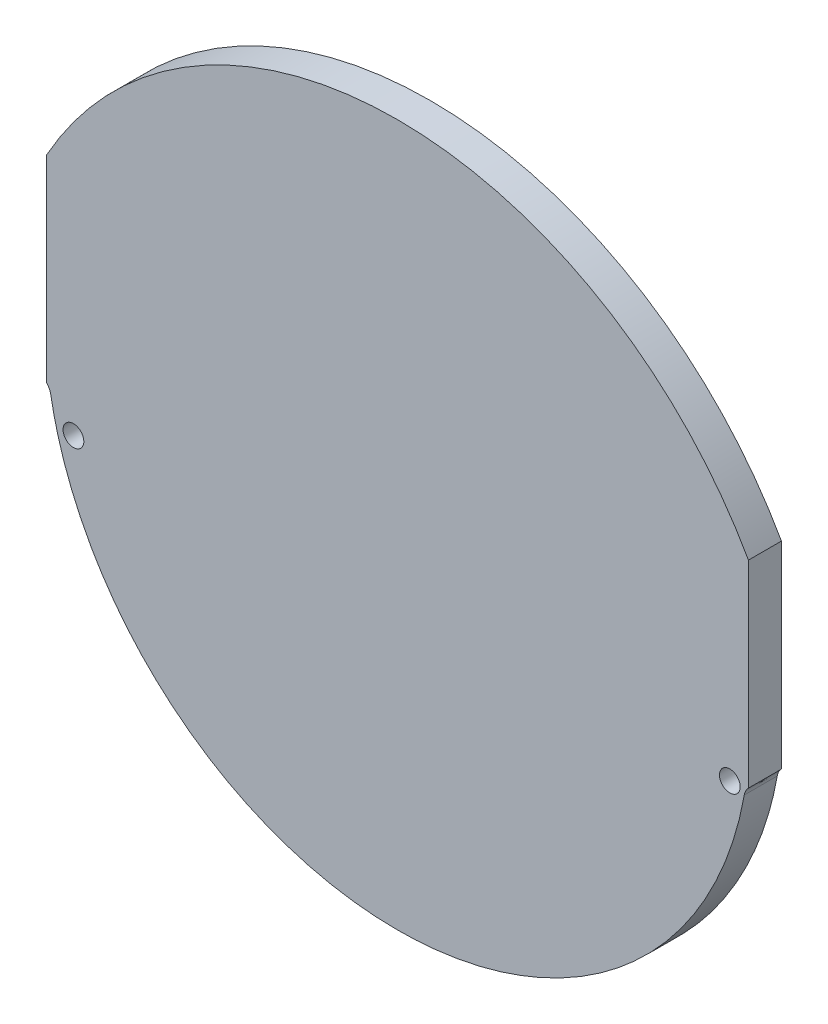
ISO-10303-21;
HEADER;
FILE_DESCRIPTION(('STEP AP214'),'2;1');
FILE_NAME('part.step','',(''),(''),'','','');
FILE_SCHEMA(('AUTOMOTIVE_DESIGN { 1 0 10303 214 1 1 1 1 }'));
ENDSEC;
DATA;
#1=APPLICATION_CONTEXT('core data for automotive mechanical design processes');
#2=APPLICATION_PROTOCOL_DEFINITION('international standard','automotive_design',2000,#1);
#3=PRODUCT_CONTEXT('',#1,'mechanical');
#4=PRODUCT('Part','Part','',(#3));
#5=PRODUCT_RELATED_PRODUCT_CATEGORY('part','',(#4));
#6=PRODUCT_DEFINITION_FORMATION('','',#4);
#7=PRODUCT_DEFINITION_CONTEXT('part definition',#1,'design');
#8=PRODUCT_DEFINITION('design','',#6,#7);
#9=PRODUCT_DEFINITION_SHAPE('','',#8);
#10=(LENGTH_UNIT() NAMED_UNIT(*) SI_UNIT(.MILLI.,.METRE.));
#11=(NAMED_UNIT(*) PLANE_ANGLE_UNIT() SI_UNIT($,.RADIAN.));
#12=(NAMED_UNIT(*) SI_UNIT($,.STERADIAN.) SOLID_ANGLE_UNIT());
#13=UNCERTAINTY_MEASURE_WITH_UNIT(LENGTH_MEASURE(1.E-05),#10,'distance_accuracy_value','');
#14=(GEOMETRIC_REPRESENTATION_CONTEXT(3) GLOBAL_UNCERTAINTY_ASSIGNED_CONTEXT((#13)) GLOBAL_UNIT_ASSIGNED_CONTEXT((#10,
#11,#12)) REPRESENTATION_CONTEXT('',''));
#15=CARTESIAN_POINT('',(0.,0.,0.));
#16=DIRECTION('',(0.,0.,1.));
#17=DIRECTION('',(1.,0.,0.));
#18=AXIS2_PLACEMENT_3D('',#15,#16,#17);
#19=CARTESIAN_POINT('',(-33.3995339320001,-5.83897062436158,266.377513628299));
#20=CARTESIAN_POINT('',(-33.0522532852939,-7.79830969295023,266.377513628299));
#21=CARTESIAN_POINT('',(-32.2812242202669,-10.6474672692101,266.377513628299));
#22=CARTESIAN_POINT('',(-31.1457311342893,-13.3656915925748,266.377513628299));
#23=CARTESIAN_POINT('',(-30.5181652192013,-14.7033137181358,266.377513628299));
#24=CARTESIAN_POINT('',(-30.2990203098189,-15.1456109818265,266.377513628299));
#25=CARTESIAN_POINT('',(-29.8408870436323,-16.0230767750388,266.377513628299));
#26=CARTESIAN_POINT('',(-29.6012280362201,-16.4592508586859,266.377513628299));
#27=CARTESIAN_POINT('',(-28.3592084487197,-18.6073694921688,266.377513628299));
#28=CARTESIAN_POINT('',(-27.2298143300265,-20.2158265888063,266.377513628299));
#29=CARTESIAN_POINT('',(-25.0188567184647,-22.8405680941703,266.377513628299));
#30=CARTESIAN_POINT('',(-23.9959305667219,-23.9043734804345,266.377513628299));
#31=CARTESIAN_POINT('',(-22.5326828725777,-25.2422683729324,266.377513628299));
#32=CARTESIAN_POINT('',(-22.1581080645461,-25.5704468359756,266.377513628299));
#33=CARTESIAN_POINT('',(-20.260791978996,-27.1617011530434,266.377513628299));
#34=CARTESIAN_POINT('',(-18.652171115365,-28.2877371001331,266.377513628299));
#35=CARTESIAN_POINT('',(-16.1029838612524,-29.756171423986,266.377513628299));
#36=CARTESIAN_POINT('',(-15.2305493530818,-30.2088859186686,266.377513628299));
#37=CARTESIAN_POINT('',(-13.4402988902694,-31.0408352854184,266.377513628299));
#38=CARTESIAN_POINT('',(-12.5182440430673,-31.4216027233659,266.377513628299));
#39=CARTESIAN_POINT('',(-9.73033512710061,-32.4368506431208,266.377513628299));
#40=CARTESIAN_POINT('',(-7.83504811353646,-32.9470482291163,266.377513628299));
#41=CARTESIAN_POINT('',(-4.93618049145972,-33.4582341560251,266.377513628299));
#42=CARTESIAN_POINT('',(-3.96056971174686,-33.5862835283673,266.377513628299));
#43=CARTESIAN_POINT('',(-1.9905687605789,-33.7570714582641,266.377513628299));
#44=CARTESIAN_POINT('',(-0.994552943017528,-33.7995927213897,266.377513628299));
#45=CARTESIAN_POINT('',(7.01465112202871E-06,-33.7996091059439,266.377513628299));
#46=B_SPLINE_CURVE_WITH_KNOTS('',3,(#19,#20,#21,#22,#23,#24,#25,#26,#27,#28,#29,#30,#31,#32,#33,
#34,#35,#36,#37,#38,#39,#40,#41,#42,#43,#44,#45),.UNSPECIFIED.,.F.,.F.,(4,1,2,2,2,2,2,2,2,2,2,2,
2,4),(0.,0.124999999999999,0.187499999999999,0.218749999999999,0.249999999999999,
0.374999999999998,0.468749999999998,0.499999999999998,0.624999999999999,0.687499999999999,
0.749999999999999,0.875,0.9375,1.),.UNSPECIFIED.);
#47=DIRECTION('',(0.,0.,-1.));
#48=VECTOR('',#47,1.);
#49=SURFACE_OF_LINEAR_EXTRUSION('',#46,#48);
#50=CARTESIAN_POINT('',(-33.3995339320001,-5.83897062436158,263.202513628299));
#51=CARTESIAN_POINT('',(-33.0522532852939,-7.79830969295023,263.202513628299));
#52=CARTESIAN_POINT('',(-32.2812242202669,-10.6474672692101,263.202513628299));
#53=CARTESIAN_POINT('',(-31.1457311342893,-13.3656915925748,263.202513628299));
#54=CARTESIAN_POINT('',(-30.5181652192013,-14.7033137181358,263.202513628299));
#55=CARTESIAN_POINT('',(-30.2990203098189,-15.1456109818265,263.202513628299));
#56=CARTESIAN_POINT('',(-29.8408870436323,-16.0230767750388,263.202513628299));
#57=CARTESIAN_POINT('',(-29.6012280362201,-16.4592508586859,263.202513628299));
#58=CARTESIAN_POINT('',(-28.3592084487197,-18.6073694921688,263.202513628299));
#59=CARTESIAN_POINT('',(-27.2298143300265,-20.2158265888063,263.202513628299));
#60=CARTESIAN_POINT('',(-25.0188567184647,-22.8405680941703,263.202513628299));
#61=CARTESIAN_POINT('',(-23.9959305667219,-23.9043734804345,263.202513628299));
#62=CARTESIAN_POINT('',(-22.5326828725777,-25.2422683729324,263.202513628299));
#63=CARTESIAN_POINT('',(-22.1581080645461,-25.5704468359756,263.202513628299));
#64=CARTESIAN_POINT('',(-20.260791978996,-27.1617011530434,263.202513628299));
#65=CARTESIAN_POINT('',(-18.652171115365,-28.2877371001331,263.202513628299));
#66=CARTESIAN_POINT('',(-16.1029838612524,-29.756171423986,263.202513628299));
#67=CARTESIAN_POINT('',(-15.2305493530818,-30.2088859186686,263.202513628299));
#68=CARTESIAN_POINT('',(-13.4402988902694,-31.0408352854184,263.202513628299));
#69=CARTESIAN_POINT('',(-12.5182440430673,-31.4216027233659,263.202513628299));
#70=CARTESIAN_POINT('',(-9.73033512710061,-32.4368506431208,263.202513628299));
#71=CARTESIAN_POINT('',(-7.83504811353646,-32.9470482291163,263.202513628299));
#72=CARTESIAN_POINT('',(-4.93618049145972,-33.4582341560251,263.202513628299));
#73=CARTESIAN_POINT('',(-3.96056971174686,-33.5862835283673,263.202513628299));
#74=CARTESIAN_POINT('',(-1.9905687605789,-33.7570714582641,263.202513628299));
#75=CARTESIAN_POINT('',(-0.994552943017528,-33.7995927213897,263.202513628299));
#76=CARTESIAN_POINT('',(7.01465112202871E-06,-33.7996091059439,263.202513628299));
#77=B_SPLINE_CURVE_WITH_KNOTS('',3,(#50,#51,#52,#53,#54,#55,#56,#57,#58,#59,#60,#61,#62,#63,#64,
#65,#66,#67,#68,#69,#70,#71,#72,#73,#74,#75,#76),.UNSPECIFIED.,.F.,.F.,(4,1,2,2,2,2,2,2,2,2,2,2,
2,4),(0.,0.124999999999999,0.187499999999999,0.218749999999999,0.249999999999999,
0.374999999999998,0.468749999999998,0.499999999999998,0.624999999999999,0.687499999999999,
0.749999999999999,0.875,0.9375,1.),.UNSPECIFIED.);
#78=CARTESIAN_POINT('',(-33.3995339320001,-5.83897062436158,263.202513628299));
#79=VERTEX_POINT('',#78);
#80=CARTESIAN_POINT('',(7.01378040821113E-06,-33.7996091059439,263.202513628299));
#81=VERTEX_POINT('',#80);
#82=EDGE_CURVE('E260',#79,#81,#77,.T.);
#83=ORIENTED_EDGE('',*,*,#82,.T.);
#84=DIRECTION('',(0.,0.,-1.));
#85=VECTOR('',#84,1.);
#86=CARTESIAN_POINT('',(7.01378040821113E-06,-33.7996091059439,266.377513628299));
#87=LINE('',#86,#85);
#88=CARTESIAN_POINT('',(7.01378040821113E-06,-33.7996091059439,266.377513628299));
#89=VERTEX_POINT('',#88);
#90=EDGE_CURVE('E11',#89,#81,#87,.T.);
#91=ORIENTED_EDGE('',*,*,#90,.F.);
#92=CARTESIAN_POINT('',(7.01465112202871E-06,-33.7996091059439,266.377513628299));
#93=CARTESIAN_POINT('',(-0.994552943017528,-33.7995927213897,266.377513628299));
#94=CARTESIAN_POINT('',(-1.9905687605789,-33.7570714582641,266.377513628299));
#95=CARTESIAN_POINT('',(-3.96056971174686,-33.5862835283673,266.377513628299));
#96=CARTESIAN_POINT('',(-4.93618049145972,-33.4582341560251,266.377513628299));
#97=CARTESIAN_POINT('',(-7.83504811353646,-32.9470482291163,266.377513628299));
#98=CARTESIAN_POINT('',(-9.73033512710061,-32.4368506431208,266.377513628299));
#99=CARTESIAN_POINT('',(-12.5182440430673,-31.4216027233659,266.377513628299));
#100=CARTESIAN_POINT('',(-13.4402988902694,-31.0408352854184,266.377513628299));
#101=CARTESIAN_POINT('',(-15.2305493530818,-30.2088859186686,266.377513628299));
#102=CARTESIAN_POINT('',(-16.1029838612524,-29.756171423986,266.377513628299));
#103=CARTESIAN_POINT('',(-18.652171115365,-28.2877371001331,266.377513628299));
#104=CARTESIAN_POINT('',(-20.260791978996,-27.1617011530434,266.377513628299));
#105=CARTESIAN_POINT('',(-22.1581080645461,-25.5704468359756,266.377513628299));
#106=CARTESIAN_POINT('',(-22.5326828725777,-25.2422683729324,266.377513628299));
#107=CARTESIAN_POINT('',(-23.9959305667219,-23.9043734804345,266.377513628299));
#108=CARTESIAN_POINT('',(-25.0188567184647,-22.8405680941703,266.377513628299));
#109=CARTESIAN_POINT('',(-27.2298143300265,-20.2158265888063,266.377513628299));
#110=CARTESIAN_POINT('',(-28.3592084487197,-18.6073694921688,266.377513628299));
#111=CARTESIAN_POINT('',(-29.6012280362201,-16.4592508586859,266.377513628299));
#112=CARTESIAN_POINT('',(-29.8408870436323,-16.0230767750388,266.377513628299));
#113=CARTESIAN_POINT('',(-30.2990203098189,-15.1456109818265,266.377513628299));
#114=CARTESIAN_POINT('',(-30.5181652192013,-14.7033137181358,266.377513628299));
#115=CARTESIAN_POINT('',(-31.1457311342893,-13.3656915925748,266.377513628299));
#116=CARTESIAN_POINT('',(-32.2812242202669,-10.6474672692101,266.377513628299));
#117=CARTESIAN_POINT('',(-33.0522532852939,-7.79830969295023,266.377513628299));
#118=CARTESIAN_POINT('',(-33.3995339320001,-5.83897062436158,266.377513628299));
#119=B_SPLINE_CURVE_WITH_KNOTS('',3,(#92,#93,#94,#95,#96,#97,#98,#99,#100,#101,#102,#103,#104,
#105,#106,#107,#108,#109,#110,#111,#112,#113,#114,#115,#116,#117,#118),.UNSPECIFIED.,.F.,.F.,(4,
2,2,2,2,2,2,2,2,2,2,2,1,4),(0.,0.0625000000000003,0.125,0.250000000000001,0.312500000000001,
0.375000000000001,0.500000000000002,0.531250000000002,0.625000000000002,0.750000000000001,
0.781250000000001,0.812500000000001,0.875000000000001,1.),.UNSPECIFIED.);
#120=CARTESIAN_POINT('',(-33.3995339320001,-5.83897062436158,266.377513628299));
#121=VERTEX_POINT('',#120);
#122=EDGE_CURVE('E318',#121,#89,#119,.F.);
#123=ORIENTED_EDGE('',*,*,#122,.F.);
#124=DIRECTION('',(0.,0.,-1.));
#125=VECTOR('',#124,1.);
#126=CARTESIAN_POINT('',(-33.3995339320001,-5.83897062436158,266.377513628299));
#127=LINE('',#126,#125);
#128=EDGE_CURVE('E134',#121,#79,#127,.T.);
#129=ORIENTED_EDGE('',*,*,#128,.T.);
#130=EDGE_LOOP('',(#83,#91,#123,#129));
#131=FACE_BOUND('',#130,.T.);
#132=ADVANCED_FACE('F39',(#131),#49,.F.);
#133=CARTESIAN_POINT('',(7.01378040821113E-06,-33.7996091059439,266.377513628299));
#134=CARTESIAN_POINT('',(1.98787599170866,-33.7995755655184,266.377513628299));
#135=CARTESIAN_POINT('',(3.94703990974269,-33.6311156111145,266.377513628299));
#136=CARTESIAN_POINT('',(6.84223254795109,-33.12287784709,266.377513628299));
#137=CARTESIAN_POINT('',(8.27894206053318,-32.8048808269043,266.377513628299));
#138=CARTESIAN_POINT('',(9.69924422101466,-32.3906139683221,266.377513628299));
#139=CARTESIAN_POINT('',(10.6424586729086,-32.0929983081551,266.377513628299));
#140=CARTESIAN_POINT('',(11.113286403757,-31.933080904516,266.377513628299));
#141=CARTESIAN_POINT('',(13.4448773583636,-31.0847622041968,266.377513628299));
#142=CARTESIAN_POINT('',(15.22806307761,-30.2581922267815,266.377513628299));
#143=CARTESIAN_POINT('',(18.2024380970386,-28.5482527814349,266.377513628299));
#144=CARTESIAN_POINT('',(19.4300495437504,-27.7305134317003,266.377513628299));
#145=CARTESIAN_POINT('',(21.0028783680466,-26.5248952873184,266.377513628299));
#146=CARTESIAN_POINT('',(21.391487804004,-26.2132198062776,266.377513628299));
#147=CARTESIAN_POINT('',(23.290603811312,-24.6213545846958,266.377513628299));
#148=CARTESIAN_POINT('',(24.6838415406317,-23.2358023245486,266.377513628299));
#149=CARTESIAN_POINT('',(26.8978179834597,-20.6117864519382,266.377513628299));
#150=CARTESIAN_POINT('',(27.7741010799933,-19.4227005268868,266.377513628299));
#151=CARTESIAN_POINT('',(28.8429407686123,-17.7487658205167,266.377513628299));
#152=CARTESIAN_POINT('',(29.1014647405657,-17.3234065748848,266.377513628299));
#153=CARTESIAN_POINT('',(30.3407611980403,-15.1810071431573,266.377513628299));
#154=CARTESIAN_POINT('',(31.1763829163418,-13.4031264132134,266.377513628299));
#155=CARTESIAN_POINT('',(32.1932885053996,-10.6392125936414,266.377513628299));
#156=CARTESIAN_POINT('',(32.4923553279812,-9.70152860695668,266.377513628299));
#157=CARTESIAN_POINT('',(33.008528869205,-7.79251656675747,266.377513628299));
#158=CARTESIAN_POINT('',(33.2258257714224,-6.81902289269481,266.377513628299));
#159=CARTESIAN_POINT('',(33.3995339320001,-5.83897062436161,266.377513628299));
#160=B_SPLINE_CURVE_WITH_KNOTS('',3,(#133,#134,#135,#136,#137,#138,#139,#140,#141,#142,#143,
#144,#145,#146,#147,#148,#149,#150,#151,#152,#153,#154,#155,#156,#157,#158,#159),.UNSPECIFIED.,
.F.,.F.,(4,2,1,2,2,2,2,2,2,2,2,2,2,4),(0.,0.125,0.1875,0.21875,0.25,0.375,0.46875,0.5,0.625,
0.71875,0.750000000000001,0.875,0.9375,1.),.UNSPECIFIED.);
#161=DIRECTION('',(0.,0.,-1.));
#162=VECTOR('',#161,1.);
#163=SURFACE_OF_LINEAR_EXTRUSION('',#160,#162);
#164=CARTESIAN_POINT('',(7.01378040821113E-06,-33.7996091059439,263.202513628299));
#165=CARTESIAN_POINT('',(1.98787599170866,-33.7995755655184,263.202513628299));
#166=CARTESIAN_POINT('',(3.94703990974269,-33.6311156111145,263.202513628299));
#167=CARTESIAN_POINT('',(6.84223254795109,-33.12287784709,263.202513628299));
#168=CARTESIAN_POINT('',(8.27894206053318,-32.8048808269043,263.202513628299));
#169=CARTESIAN_POINT('',(9.69924422101466,-32.3906139683221,263.202513628299));
#170=CARTESIAN_POINT('',(10.6424586729086,-32.0929983081551,263.202513628299));
#171=CARTESIAN_POINT('',(11.113286403757,-31.933080904516,263.202513628299));
#172=CARTESIAN_POINT('',(13.4448773583636,-31.0847622041968,263.202513628299));
#173=CARTESIAN_POINT('',(15.22806307761,-30.2581922267815,263.202513628299));
#174=CARTESIAN_POINT('',(18.2024380970386,-28.5482527814349,263.202513628299));
#175=CARTESIAN_POINT('',(19.4300495437504,-27.7305134317003,263.202513628299));
#176=CARTESIAN_POINT('',(21.0028783680466,-26.5248952873184,263.202513628299));
#177=CARTESIAN_POINT('',(21.391487804004,-26.2132198062776,263.202513628299));
#178=CARTESIAN_POINT('',(23.290603811312,-24.6213545846958,263.202513628299));
#179=CARTESIAN_POINT('',(24.6838415406317,-23.2358023245486,263.202513628299));
#180=CARTESIAN_POINT('',(26.8978179834597,-20.6117864519382,263.202513628299));
#181=CARTESIAN_POINT('',(27.7741010799933,-19.4227005268868,263.202513628299));
#182=CARTESIAN_POINT('',(28.8429407686123,-17.7487658205167,263.202513628299));
#183=CARTESIAN_POINT('',(29.1014647405657,-17.3234065748848,263.202513628299));
#184=CARTESIAN_POINT('',(30.3407611980403,-15.1810071431573,263.202513628299));
#185=CARTESIAN_POINT('',(31.1763829163418,-13.4031264132134,263.202513628299));
#186=CARTESIAN_POINT('',(32.1932885053996,-10.6392125936414,263.202513628299));
#187=CARTESIAN_POINT('',(32.4923553279812,-9.70152860695668,263.202513628299));
#188=CARTESIAN_POINT('',(33.008528869205,-7.79251656675747,263.202513628299));
#189=CARTESIAN_POINT('',(33.2258257714224,-6.81902289269481,263.202513628299));
#190=CARTESIAN_POINT('',(33.3995339320001,-5.83897062436161,263.202513628299));
#191=B_SPLINE_CURVE_WITH_KNOTS('',3,(#164,#165,#166,#167,#168,#169,#170,#171,#172,#173,#174,
#175,#176,#177,#178,#179,#180,#181,#182,#183,#184,#185,#186,#187,#188,#189,#190),.UNSPECIFIED.,
.F.,.F.,(4,2,1,2,2,2,2,2,2,2,2,2,2,4),(0.,0.125,0.1875,0.21875,0.25,0.375,0.46875,0.5,0.625,
0.71875,0.750000000000001,0.875,0.9375,1.),.UNSPECIFIED.);
#192=CARTESIAN_POINT('',(33.3995339320001,-5.83897062436161,263.202513628299));
#193=VERTEX_POINT('',#192);
#194=EDGE_CURVE('E264',#81,#193,#191,.T.);
#195=ORIENTED_EDGE('',*,*,#194,.T.);
#196=DIRECTION('',(0.,0.,-1.));
#197=VECTOR('',#196,1.);
#198=CARTESIAN_POINT('',(33.3995339320001,-5.83897062436161,266.377513628299));
#199=LINE('',#198,#197);
#200=CARTESIAN_POINT('',(33.3995339320001,-5.83897062436161,266.377513628299));
#201=VERTEX_POINT('',#200);
#202=EDGE_CURVE('E52',#201,#193,#199,.T.);
#203=ORIENTED_EDGE('',*,*,#202,.F.);
#204=CARTESIAN_POINT('',(33.3995339320001,-5.83897062436161,266.377513628299));
#205=CARTESIAN_POINT('',(33.2258257714224,-6.81902289269481,266.377513628299));
#206=CARTESIAN_POINT('',(33.008528869205,-7.79251656675747,266.377513628299));
#207=CARTESIAN_POINT('',(32.4923553279812,-9.70152860695668,266.377513628299));
#208=CARTESIAN_POINT('',(32.1932885053996,-10.6392125936414,266.377513628299));
#209=CARTESIAN_POINT('',(31.1763829163418,-13.4031264132134,266.377513628299));
#210=CARTESIAN_POINT('',(30.3407611980403,-15.1810071431573,266.377513628299));
#211=CARTESIAN_POINT('',(29.1014647405657,-17.3234065748848,266.377513628299));
#212=CARTESIAN_POINT('',(28.8429407686123,-17.7487658205167,266.377513628299));
#213=CARTESIAN_POINT('',(27.7741010799933,-19.4227005268868,266.377513628299));
#214=CARTESIAN_POINT('',(26.8978179834597,-20.6117864519382,266.377513628299));
#215=CARTESIAN_POINT('',(24.6838415406317,-23.2358023245486,266.377513628299));
#216=CARTESIAN_POINT('',(23.290603811312,-24.6213545846958,266.377513628299));
#217=CARTESIAN_POINT('',(21.391487804004,-26.2132198062776,266.377513628299));
#218=CARTESIAN_POINT('',(21.0028783680466,-26.5248952873184,266.377513628299));
#219=CARTESIAN_POINT('',(19.4300495437504,-27.7305134317003,266.377513628299));
#220=CARTESIAN_POINT('',(18.2024380970386,-28.5482527814349,266.377513628299));
#221=CARTESIAN_POINT('',(15.22806307761,-30.2581922267815,266.377513628299));
#222=CARTESIAN_POINT('',(13.4448773583636,-31.0847622041968,266.377513628299));
#223=CARTESIAN_POINT('',(11.113286403757,-31.933080904516,266.377513628299));
#224=CARTESIAN_POINT('',(10.6424586729086,-32.0929983081551,266.377513628299));
#225=CARTESIAN_POINT('',(9.69924422101466,-32.3906139683221,266.377513628299));
#226=CARTESIAN_POINT('',(8.27894206053318,-32.8048808269043,266.377513628299));
#227=CARTESIAN_POINT('',(6.84223254795109,-33.12287784709,266.377513628299));
#228=CARTESIAN_POINT('',(3.94703990974269,-33.6311156111145,266.377513628299));
#229=CARTESIAN_POINT('',(1.98787599170866,-33.7995755655184,266.377513628299));
#230=CARTESIAN_POINT('',(7.01378040821113E-06,-33.7996091059439,266.377513628299));
#231=B_SPLINE_CURVE_WITH_KNOTS('',3,(#204,#205,#206,#207,#208,#209,#210,#211,#212,#213,#214,
#215,#216,#217,#218,#219,#220,#221,#222,#223,#224,#225,#226,#227,#228,#229,#230),.UNSPECIFIED.,
.F.,.F.,(4,2,2,2,2,2,2,2,2,2,2,1,2,4),(0.,0.0624999999999999,0.125,0.249999999999999,0.28125,
0.375,0.5,0.53125,0.625,0.75,0.78125,0.8125,0.875,1.),.UNSPECIFIED.);
#232=EDGE_CURVE('E103',#89,#201,#231,.F.);
#233=ORIENTED_EDGE('',*,*,#232,.F.);
#234=ORIENTED_EDGE('',*,*,#90,.T.);
#235=EDGE_LOOP('',(#195,#203,#233,#234));
#236=FACE_BOUND('',#235,.T.);
#237=ADVANCED_FACE('F216',(#236),#163,.F.);
#238=CARTESIAN_POINT('',(33.3995339320001,-5.83897062436162,266.377513628299));
#239=CARTESIAN_POINT('',(33.4254199233074,-5.69292322846279,266.377513628299));
#240=CARTESIAN_POINT('',(33.4716276343257,-5.55407498710606,266.377513628299));
#241=CARTESIAN_POINT('',(33.6072008612577,-5.29166755037677,266.377513628299));
#242=CARTESIAN_POINT('',(33.6949271422319,-5.17213670912682,266.377513628299));
#243=CARTESIAN_POINT('',(33.8000173979069,-5.06735516104984,266.377513628299));
#244=B_SPLINE_CURVE_WITH_KNOTS('',3,(#238,#239,#240,#241,#242,#243),.UNSPECIFIED.,.F.,.F.,(4,2,
4),(0.,0.5,1.),.UNSPECIFIED.);
#245=DIRECTION('',(0.,0.,-1.));
#246=VECTOR('',#245,1.);
#247=SURFACE_OF_LINEAR_EXTRUSION('',#244,#246);
#248=CARTESIAN_POINT('',(33.3995339320001,-5.83897062436162,263.202513628299));
#249=CARTESIAN_POINT('',(33.4254199233074,-5.69292322846279,263.202513628299));
#250=CARTESIAN_POINT('',(33.4716276343257,-5.55407498710606,263.202513628299));
#251=CARTESIAN_POINT('',(33.6072008612577,-5.29166755037677,263.202513628299));
#252=CARTESIAN_POINT('',(33.6949271422319,-5.17213670912682,263.202513628299));
#253=CARTESIAN_POINT('',(33.8000173979069,-5.06735516104984,263.202513628299));
#254=B_SPLINE_CURVE_WITH_KNOTS('',3,(#248,#249,#250,#251,#252,#253),.UNSPECIFIED.,.F.,.F.,(4,2,
4),(0.,0.5,1.),.UNSPECIFIED.);
#255=CARTESIAN_POINT('',(33.8000173979069,-5.06735516104984,263.202513628299));
#256=VERTEX_POINT('',#255);
#257=EDGE_CURVE('E269',#193,#256,#254,.T.);
#258=ORIENTED_EDGE('',*,*,#257,.T.);
#259=DIRECTION('',(0.,0.,-1.));
#260=VECTOR('',#259,1.);
#261=CARTESIAN_POINT('',(33.8000173979069,-5.06735516104984,266.377513628299));
#262=LINE('',#261,#260);
#263=CARTESIAN_POINT('',(33.8000173979069,-5.06735516104984,266.377513628299));
#264=VERTEX_POINT('',#263);
#265=EDGE_CURVE('E178',#264,#256,#262,.T.);
#266=ORIENTED_EDGE('',*,*,#265,.F.);
#267=CARTESIAN_POINT('',(33.8000173979069,-5.06735516104984,266.377513628299));
#268=CARTESIAN_POINT('',(33.6949271422319,-5.17213670912682,266.377513628299));
#269=CARTESIAN_POINT('',(33.6072008612577,-5.29166755037677,266.377513628299));
#270=CARTESIAN_POINT('',(33.4716276343257,-5.55407498710606,266.377513628299));
#271=CARTESIAN_POINT('',(33.4254199233074,-5.69292322846279,266.377513628299));
#272=CARTESIAN_POINT('',(33.3995339320001,-5.83897062436162,266.377513628299));
#273=B_SPLINE_CURVE_WITH_KNOTS('',3,(#267,#268,#269,#270,#271,#272),.UNSPECIFIED.,.F.,.F.,(4,2,
4),(0.,0.5,1.),.UNSPECIFIED.);
#274=EDGE_CURVE('E303',#201,#264,#273,.F.);
#275=ORIENTED_EDGE('',*,*,#274,.F.);
#276=ORIENTED_EDGE('',*,*,#202,.T.);
#277=EDGE_LOOP('',(#258,#266,#275,#276));
#278=FACE_BOUND('',#277,.T.);
#279=ADVANCED_FACE('F226',(#278),#247,.F.);
#280=CARTESIAN_POINT('',(33.8000173979069,-5.06735516104988,266.377513628299));
#281=DIRECTION('',(-1.,0.,0.));
#282=DIRECTION('',(0.,-1.,0.));
#283=AXIS2_PLACEMENT_3D('',#280,#281,#282);
#284=PLANE('',#283);
#285=DIRECTION('',(0.,1.,0.));
#286=VECTOR('',#285,1.);
#287=CARTESIAN_POINT('',(33.8000173979069,-5.06735516104988,263.202513628299));
#288=LINE('',#287,#286);
#289=CARTESIAN_POINT('',(33.8000173979069,13.9554586526183,263.202513628299));
#290=VERTEX_POINT('',#289);
#291=EDGE_CURVE('E176',#256,#290,#288,.T.);
#292=ORIENTED_EDGE('',*,*,#291,.T.);
#293=DIRECTION('',(0.,0.,-1.));
#294=VECTOR('',#293,1.);
#295=CARTESIAN_POINT('',(33.8000173979069,13.9554586526183,266.377513628299));
#296=LINE('',#295,#294);
#297=CARTESIAN_POINT('',(33.8000173979069,13.9554586526183,266.377513628299));
#298=VERTEX_POINT('',#297);
#299=EDGE_CURVE('E129',#298,#290,#296,.T.);
#300=ORIENTED_EDGE('',*,*,#299,.F.);
#301=DIRECTION('',(0.,1.,0.));
#302=VECTOR('',#301,1.);
#303=CARTESIAN_POINT('',(33.8000173979069,-5.06735516104988,266.377513628299));
#304=LINE('',#303,#302);
#305=EDGE_CURVE('E120',#264,#298,#304,.T.);
#306=ORIENTED_EDGE('',*,*,#305,.F.);
#307=ORIENTED_EDGE('',*,*,#265,.T.);
#308=EDGE_LOOP('',(#292,#300,#306,#307));
#309=FACE_BOUND('',#308,.T.);
#310=ADVANCED_FACE('F348',(#309),#284,.F.);
#311=CARTESIAN_POINT('',(0.,-4.90627961347528,266.377513628299));
#312=DIRECTION('',(0.,0.,-1.));
#313=DIRECTION('',(-1.,0.,0.));
#314=AXIS2_PLACEMENT_3D('',#311,#312,#313);
#315=CYLINDRICAL_SURFACE('',#314,38.706670568746);
#316=CARTESIAN_POINT('',(0.,-4.90627961347528,263.202513628299));
#317=DIRECTION('',(0.,0.,1.));
#318=DIRECTION('',(1.,0.,0.));
#319=AXIS2_PLACEMENT_3D('',#316,#317,#318);
#320=CIRCLE('',#319,38.706670568746);
#321=CARTESIAN_POINT('',(-33.8000173979069,13.9554586526182,263.202513628299));
#322=VERTEX_POINT('',#321);
#323=EDGE_CURVE('E128',#290,#322,#320,.T.);
#324=ORIENTED_EDGE('',*,*,#323,.T.);
#325=DIRECTION('',(0.,0.,-1.));
#326=VECTOR('',#325,1.);
#327=CARTESIAN_POINT('',(-33.8000173979069,13.9554586526182,266.377513628299));
#328=LINE('',#327,#326);
#329=CARTESIAN_POINT('',(-33.8000173979069,13.9554586526182,266.377513628299));
#330=VERTEX_POINT('',#329);
#331=EDGE_CURVE('E125',#330,#322,#328,.T.);
#332=ORIENTED_EDGE('',*,*,#331,.F.);
#333=CARTESIAN_POINT('',(0.,-4.90627961347528,266.377513628299));
#334=DIRECTION('',(0.,0.,1.));
#335=DIRECTION('',(1.,0.,0.));
#336=AXIS2_PLACEMENT_3D('',#333,#334,#335);
#337=CIRCLE('',#336,38.706670568746);
#338=EDGE_CURVE('E114',#298,#330,#337,.T.);
#339=ORIENTED_EDGE('',*,*,#338,.F.);
#340=ORIENTED_EDGE('',*,*,#299,.T.);
#341=EDGE_LOOP('',(#324,#332,#339,#340));
#342=FACE_BOUND('',#341,.T.);
#343=ADVANCED_FACE('F126',(#342),#315,.T.);
#344=CARTESIAN_POINT('',(-33.8000173979069,13.9554586526182,266.377513628299));
#345=DIRECTION('',(1.,0.,0.));
#346=DIRECTION('',(0.,1.,0.));
#347=AXIS2_PLACEMENT_3D('',#344,#345,#346);
#348=PLANE('',#347);
#349=DIRECTION('',(0.,-1.,0.));
#350=VECTOR('',#349,1.);
#351=CARTESIAN_POINT('',(-33.8000173979069,13.9554586526182,263.202513628299));
#352=LINE('',#351,#350);
#353=CARTESIAN_POINT('',(-33.8000173979069,-5.06735516104985,263.202513628299));
#354=VERTEX_POINT('',#353);
#355=EDGE_CURVE('E88',#322,#354,#352,.T.);
#356=ORIENTED_EDGE('',*,*,#355,.T.);
#357=DIRECTION('',(0.,0.,-1.));
#358=VECTOR('',#357,1.);
#359=CARTESIAN_POINT('',(-33.8000173979069,-5.06735516104985,266.377513628299));
#360=LINE('',#359,#358);
#361=CARTESIAN_POINT('',(-33.8000173979069,-5.06735516104985,266.377513628299));
#362=VERTEX_POINT('',#361);
#363=EDGE_CURVE('E130',#362,#354,#360,.T.);
#364=ORIENTED_EDGE('',*,*,#363,.F.);
#365=DIRECTION('',(0.,-1.,0.));
#366=VECTOR('',#365,1.);
#367=CARTESIAN_POINT('',(-33.8000173979069,13.9554586526182,266.377513628299));
#368=LINE('',#367,#366);
#369=EDGE_CURVE('E118',#330,#362,#368,.T.);
#370=ORIENTED_EDGE('',*,*,#369,.F.);
#371=ORIENTED_EDGE('',*,*,#331,.T.);
#372=EDGE_LOOP('',(#356,#364,#370,#371));
#373=FACE_BOUND('',#372,.T.);
#374=ADVANCED_FACE('F132',(#373),#348,.F.);
#375=CARTESIAN_POINT('',(-33.8000173979069,-5.06735516104985,266.377513628299));
#376=CARTESIAN_POINT('',(-33.6949354772236,-5.17212839861952,266.377513628299));
#377=CARTESIAN_POINT('',(-33.6082884688821,-5.29000479485067,266.377513628299));
#378=CARTESIAN_POINT('',(-33.4723239613256,-5.55229063893634,266.377513628299));
#379=CARTESIAN_POINT('',(-33.4254259483345,-5.69288923557825,266.377513628299));
#380=CARTESIAN_POINT('',(-33.3995339320001,-5.83897062436158,266.377513628299));
#381=B_SPLINE_CURVE_WITH_KNOTS('',3,(#375,#376,#377,#378,#379,#380),.UNSPECIFIED.,.F.,.F.,(4,2,
4),(0.,0.5,1.),.UNSPECIFIED.);
#382=DIRECTION('',(0.,0.,-1.));
#383=VECTOR('',#382,1.);
#384=SURFACE_OF_LINEAR_EXTRUSION('',#381,#383);
#385=CARTESIAN_POINT('',(-33.8000173979069,-5.06735516104985,263.202513628299));
#386=CARTESIAN_POINT('',(-33.6949354772236,-5.17212839861952,263.202513628299));
#387=CARTESIAN_POINT('',(-33.6082884688821,-5.29000479485067,263.202513628299));
#388=CARTESIAN_POINT('',(-33.4723239613256,-5.55229063893634,263.202513628299));
#389=CARTESIAN_POINT('',(-33.4254259483345,-5.69288923557825,263.202513628299));
#390=CARTESIAN_POINT('',(-33.3995339320001,-5.83897062436158,263.202513628299));
#391=B_SPLINE_CURVE_WITH_KNOTS('',3,(#385,#386,#387,#388,#389,#390),.UNSPECIFIED.,.F.,.F.,(4,2,
4),(0.,0.5,1.),.UNSPECIFIED.);
#392=EDGE_CURVE('E94',#354,#79,#391,.T.);
#393=ORIENTED_EDGE('',*,*,#392,.T.);
#394=ORIENTED_EDGE('',*,*,#128,.F.);
#395=CARTESIAN_POINT('',(-33.3995339320001,-5.83897062436158,266.377513628299));
#396=CARTESIAN_POINT('',(-33.4254259483345,-5.69288923557825,266.377513628299));
#397=CARTESIAN_POINT('',(-33.4723239613256,-5.55229063893634,266.377513628299));
#398=CARTESIAN_POINT('',(-33.6082884688821,-5.29000479485067,266.377513628299));
#399=CARTESIAN_POINT('',(-33.6949354772236,-5.17212839861952,266.377513628299));
#400=CARTESIAN_POINT('',(-33.8000173979069,-5.06735516104985,266.377513628299));
#401=B_SPLINE_CURVE_WITH_KNOTS('',3,(#395,#396,#397,#398,#399,#400),.UNSPECIFIED.,.F.,.F.,(4,2,
4),(0.,0.5,1.),.UNSPECIFIED.);
#402=EDGE_CURVE('E61',#362,#121,#401,.F.);
#403=ORIENTED_EDGE('',*,*,#402,.F.);
#404=ORIENTED_EDGE('',*,*,#363,.T.);
#405=EDGE_LOOP('',(#393,#394,#403,#404));
#406=FACE_BOUND('',#405,.T.);
#407=ADVANCED_FACE('F153',(#406),#384,.F.);
#408=CARTESIAN_POINT('',(-21.778644847436,-25.8886976993892,266.377513628299));
#409=DIRECTION('',(0.,0.,-1.));
#410=DIRECTION('',(-1.,0.,0.));
#411=AXIS2_PLACEMENT_3D('',#408,#409,#410);
#412=PLANE('',#411);
#413=CARTESIAN_POINT('',(-31.2160643993176,-8.16443665346959,266.377513628299));
#414=DIRECTION('',(0.,0.,1.));
#415=DIRECTION('',(1.,0.,0.));
#416=AXIS2_PLACEMENT_3D('',#413,#414,#415);
#417=CIRCLE('',#416,1.);
#418=CARTESIAN_POINT('',(-30.2160643993176,-8.16443665346959,266.377513628299));
#419=VERTEX_POINT('',#418);
#420=EDGE_CURVE('E255',#419,#419,#417,.T.);
#421=ORIENTED_EDGE('',*,*,#420,.F.);
#422=EDGE_LOOP('',(#421));
#423=FACE_BOUND('',#422,.T.);
#424=CARTESIAN_POINT('',(32.0093023749139,-5.35898951564747,266.377513628299));
#425=DIRECTION('',(0.,0.,1.));
#426=DIRECTION('',(1.,0.,0.));
#427=AXIS2_PLACEMENT_3D('',#424,#425,#426);
#428=CIRCLE('',#427,0.999999999998764);
#429=CARTESIAN_POINT('',(33.0093023749126,-5.35898951564747,266.377513628299));
#430=VERTEX_POINT('',#429);
#431=EDGE_CURVE('E252',#430,#430,#428,.T.);
#432=ORIENTED_EDGE('',*,*,#431,.F.);
#433=EDGE_LOOP('',(#432));
#434=FACE_BOUND('',#433,.T.);
#435=ORIENTED_EDGE('',*,*,#122,.T.);
#436=ORIENTED_EDGE('',*,*,#232,.T.);
#437=ORIENTED_EDGE('',*,*,#274,.T.);
#438=ORIENTED_EDGE('',*,*,#305,.T.);
#439=ORIENTED_EDGE('',*,*,#338,.T.);
#440=ORIENTED_EDGE('',*,*,#369,.T.);
#441=ORIENTED_EDGE('',*,*,#402,.T.);
#442=EDGE_LOOP('',(#435,#436,#437,#438,#439,#440,#441));
#443=FACE_BOUND('',#442,.T.);
#444=ADVANCED_FACE('F116',(#423,#434,#443),#412,.F.);
#445=CARTESIAN_POINT('',(-21.778644847436,-25.8886976993892,263.202513628299));
#446=DIRECTION('',(0.,0.,-1.));
#447=DIRECTION('',(-1.,0.,0.));
#448=AXIS2_PLACEMENT_3D('',#445,#446,#447);
#449=PLANE('',#448);
#450=CARTESIAN_POINT('',(-31.2160643993176,-8.16443665346959,263.202513628299));
#451=DIRECTION('',(0.,0.,1.));
#452=DIRECTION('',(1.,0.,0.));
#453=AXIS2_PLACEMENT_3D('',#450,#451,#452);
#454=CIRCLE('',#453,1.);
#455=CARTESIAN_POINT('',(-30.2160643993176,-8.16443665346959,263.202513628299));
#456=VERTEX_POINT('',#455);
#457=EDGE_CURVE('E258',#456,#456,#454,.T.);
#458=ORIENTED_EDGE('',*,*,#457,.T.);
#459=EDGE_LOOP('',(#458));
#460=FACE_BOUND('',#459,.T.);
#461=CARTESIAN_POINT('',(32.0093023749139,-5.35898951564747,263.202513628299));
#462=DIRECTION('',(0.,0.,1.));
#463=DIRECTION('',(1.,0.,0.));
#464=AXIS2_PLACEMENT_3D('',#461,#462,#463);
#465=CIRCLE('',#464,0.999999999998764);
#466=CARTESIAN_POINT('',(33.0093023749126,-5.35898951564747,263.202513628299));
#467=VERTEX_POINT('',#466);
#468=EDGE_CURVE('E246',#467,#467,#465,.T.);
#469=ORIENTED_EDGE('',*,*,#468,.T.);
#470=EDGE_LOOP('',(#469));
#471=FACE_BOUND('',#470,.T.);
#472=ORIENTED_EDGE('',*,*,#82,.F.);
#473=ORIENTED_EDGE('',*,*,#392,.F.);
#474=ORIENTED_EDGE('',*,*,#355,.F.);
#475=ORIENTED_EDGE('',*,*,#323,.F.);
#476=ORIENTED_EDGE('',*,*,#291,.F.);
#477=ORIENTED_EDGE('',*,*,#257,.F.);
#478=ORIENTED_EDGE('',*,*,#194,.F.);
#479=EDGE_LOOP('',(#472,#473,#474,#475,#476,#477,#478));
#480=FACE_BOUND('',#479,.T.);
#481=ADVANCED_FACE('F163',(#460,#471,#480),#449,.T.);
#482=CARTESIAN_POINT('',(32.0093023749139,-5.35898951564747,263.202513628299));
#483=DIRECTION('',(0.,0.,1.));
#484=DIRECTION('',(1.,0.,0.));
#485=AXIS2_PLACEMENT_3D('',#482,#483,#484);
#486=CYLINDRICAL_SURFACE('',#485,0.999999999998764);
#487=ORIENTED_EDGE('',*,*,#468,.F.);
#488=EDGE_LOOP('',(#487));
#489=FACE_BOUND('',#488,.T.);
#490=ORIENTED_EDGE('',*,*,#431,.T.);
#491=EDGE_LOOP('',(#490));
#492=FACE_BOUND('',#491,.T.);
#493=ADVANCED_FACE('F191',(#489,#492),#486,.F.);
#494=CARTESIAN_POINT('',(-31.2160643993176,-8.16443665346959,263.202513628299));
#495=DIRECTION('',(0.,0.,1.));
#496=DIRECTION('',(1.,0.,0.));
#497=AXIS2_PLACEMENT_3D('',#494,#495,#496);
#498=CYLINDRICAL_SURFACE('',#497,1.);
#499=ORIENTED_EDGE('',*,*,#457,.F.);
#500=EDGE_LOOP('',(#499));
#501=FACE_BOUND('',#500,.T.);
#502=ORIENTED_EDGE('',*,*,#420,.T.);
#503=EDGE_LOOP('',(#502));
#504=FACE_BOUND('',#503,.T.);
#505=ADVANCED_FACE('F389',(#501,#504),#498,.F.);
#506=CLOSED_SHELL('',(#132,#237,#279,#310,#343,#374,#407,#444,#481,#493,#505));
#507=MANIFOLD_SOLID_BREP('B2',#506);
#508=ADVANCED_BREP_SHAPE_REPRESENTATION('',(#18,#507),#14);
#509=SHAPE_DEFINITION_REPRESENTATION(#9,#508);
ENDSEC;
END-ISO-10303-21;
